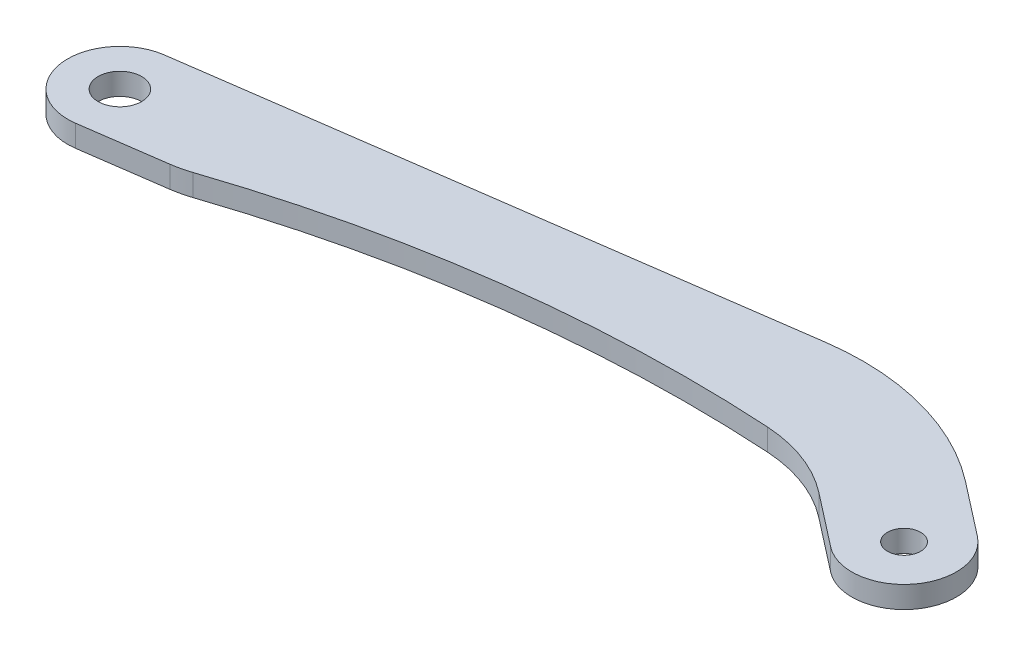
ISO-10303-21;
HEADER;
FILE_DESCRIPTION(('STEP AP214'),'2;1');
FILE_NAME('part.step','',(''),(''),'','','');
FILE_SCHEMA(('AUTOMOTIVE_DESIGN { 1 0 10303 214 1 1 1 1 }'));
ENDSEC;
DATA;
#1=APPLICATION_CONTEXT('core data for automotive mechanical design processes');
#2=APPLICATION_PROTOCOL_DEFINITION('international standard','automotive_design',2000,#1);
#3=PRODUCT_CONTEXT('',#1,'mechanical');
#4=PRODUCT('Part','Part','',(#3));
#5=PRODUCT_RELATED_PRODUCT_CATEGORY('part','',(#4));
#6=PRODUCT_DEFINITION_FORMATION('','',#4);
#7=PRODUCT_DEFINITION_CONTEXT('part definition',#1,'design');
#8=PRODUCT_DEFINITION('design','',#6,#7);
#9=PRODUCT_DEFINITION_SHAPE('','',#8);
#10=(LENGTH_UNIT() NAMED_UNIT(*) SI_UNIT(.MILLI.,.METRE.));
#11=(NAMED_UNIT(*) PLANE_ANGLE_UNIT() SI_UNIT($,.RADIAN.));
#12=(NAMED_UNIT(*) SI_UNIT($,.STERADIAN.) SOLID_ANGLE_UNIT());
#13=UNCERTAINTY_MEASURE_WITH_UNIT(LENGTH_MEASURE(1.E-05),#10,'distance_accuracy_value','');
#14=(GEOMETRIC_REPRESENTATION_CONTEXT(3) GLOBAL_UNCERTAINTY_ASSIGNED_CONTEXT((#13)) GLOBAL_UNIT_ASSIGNED_CONTEXT((#10,
#11,#12)) REPRESENTATION_CONTEXT('',''));
#15=CARTESIAN_POINT('',(0.,0.,0.));
#16=DIRECTION('',(0.,0.,1.));
#17=DIRECTION('',(1.,0.,0.));
#18=AXIS2_PLACEMENT_3D('',#15,#16,#17);
#19=CARTESIAN_POINT('',(-46.1626133881993,3.175,-9.47003936119219));
#20=DIRECTION('',(0.,-1.,0.));
#21=DIRECTION('',(0.,0.,-1.));
#22=AXIS2_PLACEMENT_3D('',#19,#20,#21);
#23=CYLINDRICAL_SURFACE('',#22,15.4617154547858);
#24=CARTESIAN_POINT('',(-46.1626133881993,0.,-9.47003936119219));
#25=DIRECTION('',(0.,1.,0.));
#26=DIRECTION('',(0.,0.,1.));
#27=AXIS2_PLACEMENT_3D('',#24,#25,#26);
#28=CIRCLE('',#27,15.4617154547858);
#29=CARTESIAN_POINT('',(-41.2616688470451,0.,5.19438655356125));
#30=VERTEX_POINT('',#29);
#31=CARTESIAN_POINT('',(-44.0019573123805,0.,5.83996423537132));
#32=VERTEX_POINT('',#31);
#33=EDGE_CURVE('E151',#30,#32,#28,.F.);
#34=ORIENTED_EDGE('',*,*,#33,.F.);
#35=DIRECTION('',(0.,-1.,0.));
#36=VECTOR('',#35,1.);
#37=CARTESIAN_POINT('',(-41.2616688470451,3.175,5.19438655356125));
#38=LINE('',#37,#36);
#39=CARTESIAN_POINT('',(-41.2616688470451,3.175,5.19438655356125));
#40=VERTEX_POINT('',#39);
#41=EDGE_CURVE('E11',#40,#30,#38,.T.);
#42=ORIENTED_EDGE('',*,*,#41,.F.);
#43=CARTESIAN_POINT('',(-46.1626133881993,3.175,-9.47003936119219));
#44=DIRECTION('',(0.,1.,0.));
#45=DIRECTION('',(0.,0.,1.));
#46=AXIS2_PLACEMENT_3D('',#43,#44,#45);
#47=CIRCLE('',#46,15.4617154547858);
#48=CARTESIAN_POINT('',(-44.0019573123805,3.175,5.83996423537132));
#49=VERTEX_POINT('',#48);
#50=EDGE_CURVE('E183',#40,#49,#47,.F.);
#51=ORIENTED_EDGE('',*,*,#50,.T.);
#52=DIRECTION('',(0.,-1.,0.));
#53=VECTOR('',#52,1.);
#54=CARTESIAN_POINT('',(-44.0019573123805,3.175,5.83996423537132));
#55=LINE('',#54,#53);
#56=EDGE_CURVE('E95',#49,#32,#55,.T.);
#57=ORIENTED_EDGE('',*,*,#56,.T.);
#58=EDGE_LOOP('',(#34,#42,#51,#57));
#59=FACE_BOUND('',#58,.T.);
#60=ADVANCED_FACE('F39',(#59),#23,.T.);
#61=CARTESIAN_POINT('',(20.8078070940033,3.175,190.916388478257));
#62=DIRECTION('',(0.,-1.,0.));
#63=DIRECTION('',(0.,0.,-1.));
#64=AXIS2_PLACEMENT_3D('',#61,#62,#63);
#65=CYLINDRICAL_SURFACE('',#64,195.819513436514);
#66=CARTESIAN_POINT('',(20.8078070940033,0.,190.916388478257));
#67=DIRECTION('',(0.,1.,0.));
#68=DIRECTION('',(0.,0.,1.));
#69=AXIS2_PLACEMENT_3D('',#66,#67,#68);
#70=CIRCLE('',#69,195.819513436514);
#71=CARTESIAN_POINT('',(32.6964341574438,0.,-4.54189962705592));
#72=VERTEX_POINT('',#71);
#73=EDGE_CURVE('E154',#72,#30,#70,.T.);
#74=ORIENTED_EDGE('',*,*,#73,.F.);
#75=DIRECTION('',(0.,-1.,0.));
#76=VECTOR('',#75,1.);
#77=CARTESIAN_POINT('',(32.6964341574438,3.175,-4.54189962705592));
#78=LINE('',#77,#76);
#79=CARTESIAN_POINT('',(32.6964341574438,3.175,-4.54189962705592));
#80=VERTEX_POINT('',#79);
#81=EDGE_CURVE('E47',#80,#72,#78,.T.);
#82=ORIENTED_EDGE('',*,*,#81,.F.);
#83=CARTESIAN_POINT('',(20.8078070940033,3.175,190.916388478257));
#84=DIRECTION('',(0.,1.,0.));
#85=DIRECTION('',(0.,0.,1.));
#86=AXIS2_PLACEMENT_3D('',#83,#84,#85);
#87=CIRCLE('',#86,195.819513436514);
#88=EDGE_CURVE('E217',#80,#40,#87,.T.);
#89=ORIENTED_EDGE('',*,*,#88,.T.);
#90=ORIENTED_EDGE('',*,*,#41,.T.);
#91=EDGE_LOOP('',(#74,#82,#89,#90));
#92=FACE_BOUND('',#91,.T.);
#93=ADVANCED_FACE('F204',(#92),#65,.F.);
#94=CARTESIAN_POINT('',(31.3749007223493,3.175,17.1851392916631));
#95=DIRECTION('',(0.,-1.,0.));
#96=DIRECTION('',(0.,0.,-1.));
#97=AXIS2_PLACEMENT_3D('',#94,#95,#96);
#98=CYLINDRICAL_SURFACE('',#97,21.7671925336182);
#99=CARTESIAN_POINT('',(31.3749007223493,0.,17.1851392916631));
#100=DIRECTION('',(0.,1.,0.));
#101=DIRECTION('',(0.,0.,1.));
#102=AXIS2_PLACEMENT_3D('',#99,#100,#101);
#103=CIRCLE('',#102,21.7671925336182);
#104=CARTESIAN_POINT('',(44.7346035005454,0.,0.));
#105=VERTEX_POINT('',#104);
#106=EDGE_CURVE('E157',#105,#72,#103,.T.);
#107=ORIENTED_EDGE('',*,*,#106,.F.);
#108=DIRECTION('',(0.,-1.,0.));
#109=VECTOR('',#108,1.);
#110=CARTESIAN_POINT('',(44.7346035005454,3.175,0.));
#111=LINE('',#110,#109);
#112=CARTESIAN_POINT('',(44.7346035005454,3.175,0.));
#113=VERTEX_POINT('',#112);
#114=EDGE_CURVE('E193',#113,#105,#111,.T.);
#115=ORIENTED_EDGE('',*,*,#114,.F.);
#116=CARTESIAN_POINT('',(31.3749007223493,3.175,17.1851392916631));
#117=DIRECTION('',(0.,1.,0.));
#118=DIRECTION('',(0.,0.,1.));
#119=AXIS2_PLACEMENT_3D('',#116,#117,#118);
#120=CIRCLE('',#119,21.7671925336182);
#121=EDGE_CURVE('E200',#113,#80,#120,.T.);
#122=ORIENTED_EDGE('',*,*,#121,.T.);
#123=ORIENTED_EDGE('',*,*,#81,.T.);
#124=EDGE_LOOP('',(#107,#115,#122,#123));
#125=FACE_BOUND('',#124,.T.);
#126=ADVANCED_FACE('F198',(#125),#98,.F.);
#127=CARTESIAN_POINT('',(16.8512587606691,3.175,-21.6764724372901));
#128=DIRECTION('',(-0.613754059351605,0.,0.789497279684627));
#129=DIRECTION('',(0.789497279684627,0.,0.613754059351605));
#130=AXIS2_PLACEMENT_3D('',#127,#128,#129);
#131=PLANE('',#130);
#132=DIRECTION('',(-0.789497279684627,0.,-0.613754059351605));
#133=VECTOR('',#132,1.);
#134=CARTESIAN_POINT('',(16.8512587606691,0.,-21.6764724372901));
#135=LINE('',#134,#133);
#136=CARTESIAN_POINT('',(52.4731940677408,0.,6.01596927119685));
#137=VERTEX_POINT('',#136);
#138=EDGE_CURVE('E160',#137,#105,#135,.T.);
#139=ORIENTED_EDGE('',*,*,#138,.F.);
#140=DIRECTION('',(0.,-1.,0.));
#141=VECTOR('',#140,1.);
#142=CARTESIAN_POINT('',(52.4731940677408,3.175,6.01596927119685));
#143=LINE('',#142,#141);
#144=CARTESIAN_POINT('',(52.4731940677408,3.175,6.01596927119685));
#145=VERTEX_POINT('',#144);
#146=EDGE_CURVE('E191',#145,#137,#143,.T.);
#147=ORIENTED_EDGE('',*,*,#146,.F.);
#148=DIRECTION('',(-0.789497279684627,0.,-0.613754059351605));
#149=VECTOR('',#148,1.);
#150=CARTESIAN_POINT('',(16.8512587606691,3.175,-21.6764724372901));
#151=LINE('',#150,#149);
#152=EDGE_CURVE('E214',#145,#113,#151,.T.);
#153=ORIENTED_EDGE('',*,*,#152,.T.);
#154=ORIENTED_EDGE('',*,*,#114,.T.);
#155=EDGE_LOOP('',(#139,#147,#153,#154));
#156=FACE_BOUND('',#155,.T.);
#157=ADVANCED_FACE('F211',(#156),#131,.T.);
#158=CARTESIAN_POINT('',(57.15,3.175,0.));
#159=DIRECTION('',(0.,-1.,0.));
#160=DIRECTION('',(0.,0.,-1.));
#161=AXIS2_PLACEMENT_3D('',#158,#159,#160);
#162=CYLINDRICAL_SURFACE('',#161,7.62);
#163=CARTESIAN_POINT('',(57.15,0.,0.));
#164=DIRECTION('',(0.,1.,0.));
#165=DIRECTION('',(0.,0.,1.));
#166=AXIS2_PLACEMENT_3D('',#163,#164,#165);
#167=CIRCLE('',#166,7.62);
#168=CARTESIAN_POINT('',(61.8268059322592,0.,-6.01596927119688));
#169=VERTEX_POINT('',#168);
#170=EDGE_CURVE('E163',#169,#137,#167,.F.);
#171=ORIENTED_EDGE('',*,*,#170,.F.);
#172=DIRECTION('',(0.,-1.,0.));
#173=VECTOR('',#172,1.);
#174=CARTESIAN_POINT('',(61.8268059322592,3.175,-6.01596927119688));
#175=LINE('',#174,#173);
#176=CARTESIAN_POINT('',(61.8268059322592,3.175,-6.01596927119688));
#177=VERTEX_POINT('',#176);
#178=EDGE_CURVE('E189',#177,#169,#175,.T.);
#179=ORIENTED_EDGE('',*,*,#178,.F.);
#180=CARTESIAN_POINT('',(57.15,3.175,0.));
#181=DIRECTION('',(0.,1.,0.));
#182=DIRECTION('',(0.,0.,1.));
#183=AXIS2_PLACEMENT_3D('',#180,#181,#182);
#184=CIRCLE('',#183,7.62);
#185=EDGE_CURVE('E219',#177,#145,#184,.F.);
#186=ORIENTED_EDGE('',*,*,#185,.T.);
#187=ORIENTED_EDGE('',*,*,#146,.T.);
#188=EDGE_LOOP('',(#171,#179,#186,#187));
#189=FACE_BOUND('',#188,.T.);
#190=ADVANCED_FACE('F243',(#189),#162,.T.);
#191=CARTESIAN_POINT('',(26.2048706251875,3.175,-33.7084109796838));
#192=DIRECTION('',(0.613754059351605,0.,-0.789497279684627));
#193=DIRECTION('',(-0.789497279684627,0.,-0.613754059351605));
#194=AXIS2_PLACEMENT_3D('',#191,#192,#193);
#195=PLANE('',#194);
#196=DIRECTION('',(0.789497279684627,0.,0.613754059351605));
#197=VECTOR('',#196,1.);
#198=CARTESIAN_POINT('',(26.2048706251875,0.,-33.7084109796838));
#199=LINE('',#198,#197);
#200=CARTESIAN_POINT('',(54.0882153650638,0.,-12.0319385423937));
#201=VERTEX_POINT('',#200);
#202=EDGE_CURVE('E166',#201,#169,#199,.T.);
#203=ORIENTED_EDGE('',*,*,#202,.F.);
#204=DIRECTION('',(0.,-1.,0.));
#205=VECTOR('',#204,1.);
#206=CARTESIAN_POINT('',(54.0882153650638,3.175,-12.0319385423937));
#207=LINE('',#206,#205);
#208=CARTESIAN_POINT('',(54.0882153650638,3.175,-12.0319385423937));
#209=VERTEX_POINT('',#208);
#210=EDGE_CURVE('E187',#209,#201,#207,.T.);
#211=ORIENTED_EDGE('',*,*,#210,.F.);
#212=DIRECTION('',(0.789497279684627,0.,0.613754059351605));
#213=VECTOR('',#212,1.);
#214=CARTESIAN_POINT('',(26.2048706251875,3.175,-33.7084109796838));
#215=LINE('',#214,#213);
#216=EDGE_CURVE('E225',#209,#177,#215,.T.);
#217=ORIENTED_EDGE('',*,*,#216,.T.);
#218=ORIENTED_EDGE('',*,*,#178,.T.);
#219=EDGE_LOOP('',(#203,#211,#217,#218));
#220=FACE_BOUND('',#219,.T.);
#221=ADVANCED_FACE('F246',(#220),#195,.T.);
#222=CARTESIAN_POINT('',(31.3749007223493,3.175,17.1851392916631));
#223=DIRECTION('',(0.,-1.,0.));
#224=DIRECTION('',(0.,0.,-1.));
#225=AXIS2_PLACEMENT_3D('',#222,#223,#224);
#226=CYLINDRICAL_SURFACE('',#225,37.0071925336182);
#227=CARTESIAN_POINT('',(31.3749007223493,0.,17.1851392916631));
#228=DIRECTION('',(0.,1.,0.));
#229=DIRECTION('',(0.,0.,1.));
#230=AXIS2_PLACEMENT_3D('',#227,#228,#229);
#231=CIRCLE('',#230,37.0071925336182);
#232=CARTESIAN_POINT('',(26.2034295728133,0.,-19.4589350638149));
#233=VERTEX_POINT('',#232);
#234=EDGE_CURVE('E169',#233,#201,#231,.F.);
#235=ORIENTED_EDGE('',*,*,#234,.F.);
#236=DIRECTION('',(0.,-1.,0.));
#237=VECTOR('',#236,1.);
#238=CARTESIAN_POINT('',(26.2034295728133,3.175,-19.4589350638149));
#239=LINE('',#238,#237);
#240=CARTESIAN_POINT('',(26.2034295728133,3.175,-19.4589350638149));
#241=VERTEX_POINT('',#240);
#242=EDGE_CURVE('E130',#241,#233,#239,.T.);
#243=ORIENTED_EDGE('',*,*,#242,.F.);
#244=CARTESIAN_POINT('',(31.3749007223493,3.175,17.1851392916631));
#245=DIRECTION('',(0.,1.,0.));
#246=DIRECTION('',(0.,0.,1.));
#247=AXIS2_PLACEMENT_3D('',#244,#245,#246);
#248=CIRCLE('',#247,37.0071925336182);
#249=EDGE_CURVE('E138',#241,#209,#248,.F.);
#250=ORIENTED_EDGE('',*,*,#249,.T.);
#251=ORIENTED_EDGE('',*,*,#210,.T.);
#252=EDGE_LOOP('',(#235,#243,#250,#251));
#253=FACE_BOUND('',#252,.T.);
#254=ADVANCED_FACE('F229',(#253),#226,.T.);
#255=CARTESIAN_POINT('',(-2.1808570104729,3.175,-15.4531436296623));
#256=DIRECTION('',(-0.139742325625974,0.,-0.990187902586496));
#257=DIRECTION('',(-0.990187902586496,0.,0.139742325625974));
#258=AXIS2_PLACEMENT_3D('',#255,#256,#257);
#259=PLANE('',#258);
#260=DIRECTION('',(0.990187902586496,0.,-0.139742325625974));
#261=VECTOR('',#260,1.);
#262=CARTESIAN_POINT('',(-2.1808570104729,0.,-15.4531436296623));
#263=LINE('',#262,#261);
#264=CARTESIAN_POINT('',(-58.2148365212699,0.,-7.5452318177091));
#265=VERTEX_POINT('',#264);
#266=EDGE_CURVE('E125',#265,#233,#263,.T.);
#267=ORIENTED_EDGE('',*,*,#266,.F.);
#268=DIRECTION('',(0.,-1.,0.));
#269=VECTOR('',#268,1.);
#270=CARTESIAN_POINT('',(-58.2148365212699,3.175,-7.5452318177091));
#271=LINE('',#270,#269);
#272=CARTESIAN_POINT('',(-58.2148365212699,3.175,-7.5452318177091));
#273=VERTEX_POINT('',#272);
#274=EDGE_CURVE('E120',#273,#265,#271,.T.);
#275=ORIENTED_EDGE('',*,*,#274,.F.);
#276=DIRECTION('',(0.990187902586496,0.,-0.139742325625974));
#277=VECTOR('',#276,1.);
#278=CARTESIAN_POINT('',(-2.1808570104729,3.175,-15.4531436296623));
#279=LINE('',#278,#277);
#280=EDGE_CURVE('E123',#273,#241,#279,.T.);
#281=ORIENTED_EDGE('',*,*,#280,.T.);
#282=ORIENTED_EDGE('',*,*,#242,.T.);
#283=EDGE_LOOP('',(#267,#275,#281,#282));
#284=FACE_BOUND('',#283,.T.);
#285=ADVANCED_FACE('F122',(#284),#259,.T.);
#286=CARTESIAN_POINT('',(-57.15,3.175,0.));
#287=DIRECTION('',(0.,-1.,0.));
#288=DIRECTION('',(0.,0.,-1.));
#289=AXIS2_PLACEMENT_3D('',#286,#287,#288);
#290=CYLINDRICAL_SURFACE('',#289,7.62);
#291=CARTESIAN_POINT('',(-57.15,0.,0.));
#292=DIRECTION('',(0.,1.,0.));
#293=DIRECTION('',(0.,0.,1.));
#294=AXIS2_PLACEMENT_3D('',#291,#292,#293);
#295=CIRCLE('',#294,7.62);
#296=CARTESIAN_POINT('',(-56.0851634787287,0.,7.5452318177089));
#297=VERTEX_POINT('',#296);
#298=EDGE_CURVE('E173',#297,#265,#295,.F.);
#299=ORIENTED_EDGE('',*,*,#298,.F.);
#300=DIRECTION('',(0.,-1.,0.));
#301=VECTOR('',#300,1.);
#302=CARTESIAN_POINT('',(-56.0851634787287,3.175,7.5452318177089));
#303=LINE('',#302,#301);
#304=CARTESIAN_POINT('',(-56.0851634787287,3.175,7.5452318177089));
#305=VERTEX_POINT('',#304);
#306=EDGE_CURVE('E88',#305,#297,#303,.T.);
#307=ORIENTED_EDGE('',*,*,#306,.F.);
#308=CARTESIAN_POINT('',(-57.15,3.175,0.));
#309=DIRECTION('',(0.,1.,0.));
#310=DIRECTION('',(0.,0.,1.));
#311=AXIS2_PLACEMENT_3D('',#308,#309,#310);
#312=CIRCLE('',#311,7.62);
#313=EDGE_CURVE('E135',#305,#273,#312,.F.);
#314=ORIENTED_EDGE('',*,*,#313,.T.);
#315=ORIENTED_EDGE('',*,*,#274,.T.);
#316=EDGE_LOOP('',(#299,#307,#314,#315));
#317=FACE_BOUND('',#316,.T.);
#318=ADVANCED_FACE('F140',(#317),#290,.T.);
#319=CARTESIAN_POINT('',(57.15,3.175,0.));
#320=DIRECTION('',(0.,-1.,0.));
#321=DIRECTION('',(0.,0.,-1.));
#322=AXIS2_PLACEMENT_3D('',#319,#320,#321);
#323=CYLINDRICAL_SURFACE('',#322,2.413);
#324=CARTESIAN_POINT('',(57.15,3.175,0.));
#325=DIRECTION('',(0.,1.,0.));
#326=DIRECTION('',(0.,0.,1.));
#327=AXIS2_PLACEMENT_3D('',#324,#325,#326);
#328=CIRCLE('',#327,2.413);
#329=CARTESIAN_POINT('',(57.15,3.175,2.41299999999998));
#330=VERTEX_POINT('',#329);
#331=EDGE_CURVE('E142',#330,#330,#328,.T.);
#332=ORIENTED_EDGE('',*,*,#331,.T.);
#333=EDGE_LOOP('',(#332));
#334=FACE_BOUND('',#333,.T.);
#335=CARTESIAN_POINT('',(57.15,0.,0.));
#336=DIRECTION('',(0.,1.,0.));
#337=DIRECTION('',(0.,0.,1.));
#338=AXIS2_PLACEMENT_3D('',#335,#336,#337);
#339=CIRCLE('',#338,2.413);
#340=CARTESIAN_POINT('',(57.15,0.,2.41299999999998));
#341=VERTEX_POINT('',#340);
#342=EDGE_CURVE('E177',#341,#341,#339,.T.);
#343=ORIENTED_EDGE('',*,*,#342,.F.);
#344=EDGE_LOOP('',(#343));
#345=FACE_BOUND('',#344,.T.);
#346=ADVANCED_FACE('F257',(#334,#345),#323,.F.);
#347=CARTESIAN_POINT('',(-0.0511839679330561,3.175,-0.362679994244114));
#348=DIRECTION('',(-0.139742325625974,0.,-0.990187902586496));
#349=DIRECTION('',(-0.990187902586496,0.,0.139742325625974));
#350=AXIS2_PLACEMENT_3D('',#347,#348,#349);
#351=PLANE('',#350);
#352=DIRECTION('',(0.990187902586496,0.,-0.139742325625974));
#353=VECTOR('',#352,1.);
#354=CARTESIAN_POINT('',(-0.0511839679330561,0.,-0.362679994244114));
#355=LINE('',#354,#353);
#356=EDGE_CURVE('E175',#297,#32,#355,.T.);
#357=ORIENTED_EDGE('',*,*,#356,.T.);
#358=ORIENTED_EDGE('',*,*,#56,.F.);
#359=DIRECTION('',(0.990187902586496,0.,-0.139742325625974));
#360=VECTOR('',#359,1.);
#361=CARTESIAN_POINT('',(-0.0511839679330561,3.175,-0.362679994244114));
#362=LINE('',#361,#360);
#363=EDGE_CURVE('E55',#305,#49,#362,.T.);
#364=ORIENTED_EDGE('',*,*,#363,.F.);
#365=ORIENTED_EDGE('',*,*,#306,.T.);
#366=EDGE_LOOP('',(#357,#358,#364,#365));
#367=FACE_BOUND('',#366,.T.);
#368=ADVANCED_FACE('F231',(#367),#351,.F.);
#369=CARTESIAN_POINT('',(-57.15,3.175,0.));
#370=DIRECTION('',(0.,-1.,0.));
#371=DIRECTION('',(0.,0.,-1.));
#372=AXIS2_PLACEMENT_3D('',#369,#370,#371);
#373=CYLINDRICAL_SURFACE('',#372,3.175);
#374=CARTESIAN_POINT('',(-57.15,3.175,0.));
#375=DIRECTION('',(0.,1.,0.));
#376=DIRECTION('',(0.,0.,1.));
#377=AXIS2_PLACEMENT_3D('',#374,#375,#376);
#378=CIRCLE('',#377,3.175);
#379=CARTESIAN_POINT('',(-57.15,3.175,3.175));
#380=VERTEX_POINT('',#379);
#381=EDGE_CURVE('E148',#380,#380,#378,.T.);
#382=ORIENTED_EDGE('',*,*,#381,.T.);
#383=EDGE_LOOP('',(#382));
#384=FACE_BOUND('',#383,.T.);
#385=CARTESIAN_POINT('',(-57.15,0.,0.));
#386=DIRECTION('',(0.,1.,0.));
#387=DIRECTION('',(0.,0.,1.));
#388=AXIS2_PLACEMENT_3D('',#385,#386,#387);
#389=CIRCLE('',#388,3.175);
#390=CARTESIAN_POINT('',(-57.15,0.,3.175));
#391=VERTEX_POINT('',#390);
#392=EDGE_CURVE('E180',#391,#391,#389,.T.);
#393=ORIENTED_EDGE('',*,*,#392,.F.);
#394=EDGE_LOOP('',(#393));
#395=FACE_BOUND('',#394,.T.);
#396=ADVANCED_FACE('F260',(#384,#395),#373,.F.);
#397=CARTESIAN_POINT('',(0.,3.175,0.));
#398=DIRECTION('',(0.,1.,0.));
#399=DIRECTION('',(0.,0.,1.));
#400=AXIS2_PLACEMENT_3D('',#397,#398,#399);
#401=PLANE('',#400);
#402=ORIENTED_EDGE('',*,*,#50,.F.);
#403=ORIENTED_EDGE('',*,*,#88,.F.);
#404=ORIENTED_EDGE('',*,*,#121,.F.);
#405=ORIENTED_EDGE('',*,*,#152,.F.);
#406=ORIENTED_EDGE('',*,*,#185,.F.);
#407=ORIENTED_EDGE('',*,*,#216,.F.);
#408=ORIENTED_EDGE('',*,*,#249,.F.);
#409=ORIENTED_EDGE('',*,*,#280,.F.);
#410=ORIENTED_EDGE('',*,*,#313,.F.);
#411=ORIENTED_EDGE('',*,*,#363,.T.);
#412=EDGE_LOOP('',(#402,#403,#404,#405,#406,#407,#408,#409,#410,#411));
#413=FACE_BOUND('',#412,.T.);
#414=ORIENTED_EDGE('',*,*,#331,.F.);
#415=EDGE_LOOP('',(#414));
#416=FACE_BOUND('',#415,.T.);
#417=ORIENTED_EDGE('',*,*,#381,.F.);
#418=EDGE_LOOP('',(#417));
#419=FACE_BOUND('',#418,.T.);
#420=ADVANCED_FACE('F133',(#413,#416,#419),#401,.T.);
#421=CARTESIAN_POINT('',(0.,0.,0.));
#422=DIRECTION('',(0.,1.,0.));
#423=DIRECTION('',(0.,0.,1.));
#424=AXIS2_PLACEMENT_3D('',#421,#422,#423);
#425=PLANE('',#424);
#426=ORIENTED_EDGE('',*,*,#33,.T.);
#427=ORIENTED_EDGE('',*,*,#356,.F.);
#428=ORIENTED_EDGE('',*,*,#298,.T.);
#429=ORIENTED_EDGE('',*,*,#266,.T.);
#430=ORIENTED_EDGE('',*,*,#234,.T.);
#431=ORIENTED_EDGE('',*,*,#202,.T.);
#432=ORIENTED_EDGE('',*,*,#170,.T.);
#433=ORIENTED_EDGE('',*,*,#138,.T.);
#434=ORIENTED_EDGE('',*,*,#106,.T.);
#435=ORIENTED_EDGE('',*,*,#73,.T.);
#436=EDGE_LOOP('',(#426,#427,#428,#429,#430,#431,#432,#433,#434,#435));
#437=FACE_BOUND('',#436,.T.);
#438=ORIENTED_EDGE('',*,*,#342,.T.);
#439=EDGE_LOOP('',(#438));
#440=FACE_BOUND('',#439,.T.);
#441=ORIENTED_EDGE('',*,*,#392,.T.);
#442=EDGE_LOOP('',(#441));
#443=FACE_BOUND('',#442,.T.);
#444=ADVANCED_FACE('F206',(#437,#440,#443),#425,.F.);
#445=CLOSED_SHELL('',(#60,#93,#126,#157,#190,#221,#254,#285,#318,#346,#368,#396,#420,#444));
#446=MANIFOLD_SOLID_BREP('B2',#445);
#447=ADVANCED_BREP_SHAPE_REPRESENTATION('',(#18,#446),#14);
#448=SHAPE_DEFINITION_REPRESENTATION(#9,#447);
ENDSEC;
END-ISO-10303-21;
